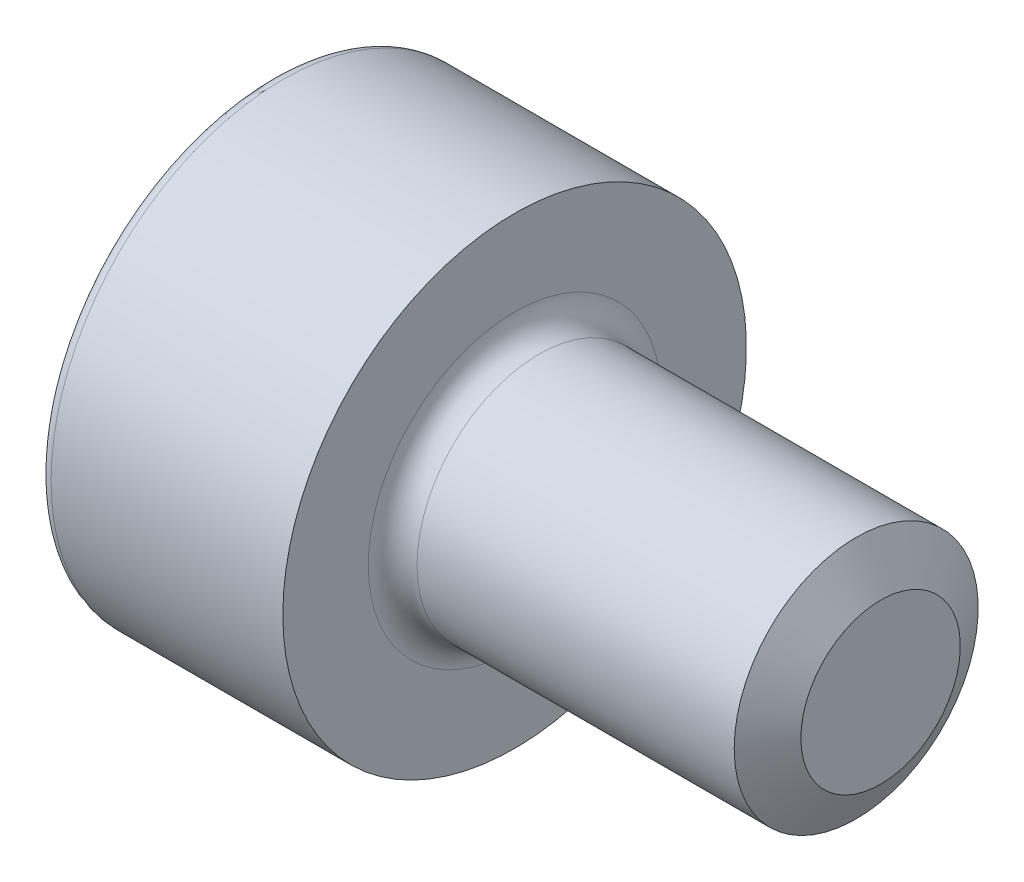
ISO-10303-21;
HEADER;
FILE_DESCRIPTION(('STEP AP214'),'2;1');
FILE_NAME('part.step','',(''),(''),'','','');
FILE_SCHEMA(('AUTOMOTIVE_DESIGN { 1 0 10303 214 1 1 1 1 }'));
ENDSEC;
DATA;
#1=APPLICATION_CONTEXT('core data for automotive mechanical design processes');
#2=APPLICATION_PROTOCOL_DEFINITION('international standard','automotive_design',2000,#1);
#3=PRODUCT_CONTEXT('',#1,'mechanical');
#4=PRODUCT('Part','Part','',(#3));
#5=PRODUCT_RELATED_PRODUCT_CATEGORY('part','',(#4));
#6=PRODUCT_DEFINITION_FORMATION('','',#4);
#7=PRODUCT_DEFINITION_CONTEXT('part definition',#1,'design');
#8=PRODUCT_DEFINITION('design','',#6,#7);
#9=PRODUCT_DEFINITION_SHAPE('','',#8);
#10=(LENGTH_UNIT() NAMED_UNIT(*) SI_UNIT(.MILLI.,.METRE.));
#11=(NAMED_UNIT(*) PLANE_ANGLE_UNIT() SI_UNIT($,.RADIAN.));
#12=(NAMED_UNIT(*) SI_UNIT($,.STERADIAN.) SOLID_ANGLE_UNIT());
#13=UNCERTAINTY_MEASURE_WITH_UNIT(LENGTH_MEASURE(1.E-05),#10,'distance_accuracy_value','');
#14=(GEOMETRIC_REPRESENTATION_CONTEXT(3) GLOBAL_UNCERTAINTY_ASSIGNED_CONTEXT((#13)) GLOBAL_UNIT_ASSIGNED_CONTEXT((#10,
#11,#12)) REPRESENTATION_CONTEXT('',''));
#15=CARTESIAN_POINT('',(0.,0.,0.));
#16=DIRECTION('',(0.,0.,1.));
#17=DIRECTION('',(1.,0.,0.));
#18=AXIS2_PLACEMENT_3D('',#15,#16,#17);
#19=CARTESIAN_POINT('',(0.,0.,0.));
#20=DIRECTION('',(-1.,0.,0.));
#21=DIRECTION('',(0.,0.,1.));
#22=AXIS2_PLACEMENT_3D('',#19,#20,#21);
#23=CYLINDRICAL_SURFACE('',#22,1.);
#24=CARTESIAN_POINT('',(2.2,0.,0.));
#25=DIRECTION('',(-1.,0.,0.));
#26=DIRECTION('',(0.,0.,1.));
#27=AXIS2_PLACEMENT_3D('',#24,#25,#26);
#28=CIRCLE('',#27,1.);
#29=CARTESIAN_POINT('',(2.2,0.,1.));
#30=VERTEX_POINT('',#29);
#31=EDGE_CURVE('E115',#30,#30,#28,.T.);
#32=ORIENTED_EDGE('',*,*,#31,.F.);
#33=EDGE_LOOP('',(#32));
#34=FACE_BOUND('',#33,.T.);
#35=CARTESIAN_POINT('',(4.80000586675271,0.,0.));
#36=DIRECTION('',(-1.,0.,0.));
#37=DIRECTION('',(0.,0.,1.));
#38=AXIS2_PLACEMENT_3D('',#35,#36,#37);
#39=CIRCLE('',#38,1.);
#40=CARTESIAN_POINT('',(4.80000586675271,0.,1.));
#41=VERTEX_POINT('',#40);
#42=EDGE_CURVE('E297',#41,#41,#39,.T.);
#43=ORIENTED_EDGE('',*,*,#42,.T.);
#44=EDGE_LOOP('',(#43));
#45=FACE_BOUND('',#44,.T.);
#46=ADVANCED_FACE('F39',(#34,#45),#23,.T.);
#47=CARTESIAN_POINT('',(0.,0.,0.));
#48=DIRECTION('',(1.,0.,0.));
#49=DIRECTION('',(0.,0.,-1.));
#50=AXIS2_PLACEMENT_3D('',#47,#48,#49);
#51=PLANE('',#50);
#52=CARTESIAN_POINT('',(0.,0.,0.));
#53=DIRECTION('',(1.,0.,0.));
#54=DIRECTION('',(0.,0.,-1.));
#55=AXIS2_PLACEMENT_3D('',#52,#53,#54);
#56=CIRCLE('',#55,1.8);
#57=CARTESIAN_POINT('',(0.,0.,-1.8));
#58=VERTEX_POINT('',#57);
#59=EDGE_CURVE('E47',#58,#58,#56,.F.);
#60=ORIENTED_EDGE('',*,*,#59,.T.);
#61=EDGE_LOOP('',(#60));
#62=FACE_BOUND('',#61,.T.);
#63=DIRECTION('',(0.,0.866025403784439,-0.5));
#64=VECTOR('',#63,1.);
#65=CARTESIAN_POINT('',(0.,0.,0.865));
#66=LINE('',#65,#64);
#67=CARTESIAN_POINT('',(0.,0.,0.865));
#68=VERTEX_POINT('',#67);
#69=CARTESIAN_POINT('',(0.,0.749111974273539,0.4325));
#70=VERTEX_POINT('',#69);
#71=EDGE_CURVE('E330',#68,#70,#66,.T.);
#72=ORIENTED_EDGE('',*,*,#71,.F.);
#73=DIRECTION('',(0.,0.866025403784439,0.5));
#74=VECTOR('',#73,1.);
#75=CARTESIAN_POINT('',(0.,-0.749111974273539,0.4325));
#76=LINE('',#75,#74);
#77=CARTESIAN_POINT('',(0.,-0.749111974273539,0.4325));
#78=VERTEX_POINT('',#77);
#79=EDGE_CURVE('E54',#78,#68,#76,.T.);
#80=ORIENTED_EDGE('',*,*,#79,.F.);
#81=DIRECTION('',(0.,0.,1.));
#82=VECTOR('',#81,1.);
#83=CARTESIAN_POINT('',(0.,-0.749111974273539,-0.4325));
#84=LINE('',#83,#82);
#85=CARTESIAN_POINT('',(0.,-0.749111974273539,-0.4325));
#86=VERTEX_POINT('',#85);
#87=EDGE_CURVE('E90',#86,#78,#84,.T.);
#88=ORIENTED_EDGE('',*,*,#87,.F.);
#89=DIRECTION('',(0.,-0.866025403784439,0.5));
#90=VECTOR('',#89,1.);
#91=CARTESIAN_POINT('',(0.,0.,-0.865));
#92=LINE('',#91,#90);
#93=CARTESIAN_POINT('',(0.,0.,-0.865));
#94=VERTEX_POINT('',#93);
#95=EDGE_CURVE('E98',#94,#86,#92,.T.);
#96=ORIENTED_EDGE('',*,*,#95,.F.);
#97=DIRECTION('',(0.,-0.866025403784439,-0.5));
#98=VECTOR('',#97,1.);
#99=CARTESIAN_POINT('',(0.,0.749111974273539,-0.4325));
#100=LINE('',#99,#98);
#101=CARTESIAN_POINT('',(0.,0.749111974273539,-0.4325));
#102=VERTEX_POINT('',#101);
#103=EDGE_CURVE('E104',#102,#94,#100,.T.);
#104=ORIENTED_EDGE('',*,*,#103,.F.);
#105=DIRECTION('',(0.,0.,-1.));
#106=VECTOR('',#105,1.);
#107=CARTESIAN_POINT('',(0.,0.749111974273539,0.4325));
#108=LINE('',#107,#106);
#109=EDGE_CURVE('E333',#70,#102,#108,.T.);
#110=ORIENTED_EDGE('',*,*,#109,.F.);
#111=EDGE_LOOP('',(#72,#80,#88,#96,#104,#110));
#112=FACE_BOUND('',#111,.T.);
#113=ADVANCED_FACE('F107',(#62,#112),#51,.F.);
#114=CARTESIAN_POINT('',(0.,0.,0.));
#115=DIRECTION('',(-1.,0.,0.));
#116=DIRECTION('',(0.,0.,1.));
#117=AXIS2_PLACEMENT_3D('',#114,#115,#116);
#118=CYLINDRICAL_SURFACE('',#117,1.9);
#119=CARTESIAN_POINT('',(0.1,0.,0.));
#120=DIRECTION('',(1.,0.,0.));
#121=DIRECTION('',(0.,0.,-1.));
#122=AXIS2_PLACEMENT_3D('',#119,#120,#121);
#123=CIRCLE('',#122,1.9);
#124=CARTESIAN_POINT('',(0.1,0.,-1.9));
#125=VERTEX_POINT('',#124);
#126=EDGE_CURVE('E11',#125,#125,#123,.T.);
#127=ORIENTED_EDGE('',*,*,#126,.T.);
#128=EDGE_LOOP('',(#127));
#129=FACE_BOUND('',#128,.T.);
#130=CARTESIAN_POINT('',(2.,0.,0.));
#131=DIRECTION('',(-1.,0.,0.));
#132=DIRECTION('',(0.,0.,1.));
#133=AXIS2_PLACEMENT_3D('',#130,#131,#132);
#134=CIRCLE('',#133,1.9);
#135=CARTESIAN_POINT('',(2.,0.,1.9));
#136=VERTEX_POINT('',#135);
#137=EDGE_CURVE('E129',#136,#136,#134,.T.);
#138=ORIENTED_EDGE('',*,*,#137,.T.);
#139=EDGE_LOOP('',(#138));
#140=FACE_BOUND('',#139,.T.);
#141=ADVANCED_FACE('F152',(#129,#140),#118,.T.);
#142=CARTESIAN_POINT('',(2.,1.9,0.));
#143=DIRECTION('',(-1.,0.,0.));
#144=DIRECTION('',(0.,0.,1.));
#145=AXIS2_PLACEMENT_3D('',#142,#143,#144);
#146=PLANE('',#145);
#147=ORIENTED_EDGE('',*,*,#137,.F.);
#148=EDGE_LOOP('',(#147));
#149=FACE_BOUND('',#148,.T.);
#150=CARTESIAN_POINT('',(2.,0.,0.));
#151=DIRECTION('',(-1.,0.,0.));
#152=DIRECTION('',(0.,0.,1.));
#153=AXIS2_PLACEMENT_3D('',#150,#151,#152);
#154=CIRCLE('',#153,1.2);
#155=CARTESIAN_POINT('',(2.,0.,1.2));
#156=VERTEX_POINT('',#155);
#157=EDGE_CURVE('E126',#156,#156,#154,.T.);
#158=ORIENTED_EDGE('',*,*,#157,.T.);
#159=EDGE_LOOP('',(#158));
#160=FACE_BOUND('',#159,.T.);
#161=ADVANCED_FACE('F161',(#149,#160),#146,.F.);
#162=CARTESIAN_POINT('',(2.2,0.,0.));
#163=DIRECTION('',(-1.,0.,0.));
#164=DIRECTION('',(0.,0.,1.));
#165=AXIS2_PLACEMENT_3D('',#162,#163,#164);
#166=TOROIDAL_SURFACE('',#165,1.2,0.2);
#167=ORIENTED_EDGE('',*,*,#157,.F.);
#168=EDGE_LOOP('',(#167));
#169=FACE_BOUND('',#168,.T.);
#170=ORIENTED_EDGE('',*,*,#31,.T.);
#171=EDGE_LOOP('',(#170));
#172=FACE_BOUND('',#171,.T.);
#173=ADVANCED_FACE('F157',(#169,#172),#166,.F.);
#174=CARTESIAN_POINT('',(1.,-0.749111974273539,0.4325));
#175=DIRECTION('',(0.,-0.5,0.866025403784439));
#176=DIRECTION('',(0.,-0.866025403784439,-0.5));
#177=AXIS2_PLACEMENT_3D('',#174,#175,#176);
#178=PLANE('',#177);
#179=ORIENTED_EDGE('',*,*,#79,.T.);
#180=DIRECTION('',(-1.,0.,0.));
#181=VECTOR('',#180,1.);
#182=CARTESIAN_POINT('',(1.,0.,0.865));
#183=LINE('',#182,#181);
#184=CARTESIAN_POINT('',(1.,0.,0.865));
#185=VERTEX_POINT('',#184);
#186=EDGE_CURVE('E122',#185,#68,#183,.T.);
#187=ORIENTED_EDGE('',*,*,#186,.F.);
#188=DIRECTION('',(0.,0.866025403784439,0.5));
#189=VECTOR('',#188,1.);
#190=CARTESIAN_POINT('',(1.,-0.749111974273539,0.4325));
#191=LINE('',#190,#189);
#192=CARTESIAN_POINT('',(1.,-0.749111974273539,0.4325));
#193=VERTEX_POINT('',#192);
#194=EDGE_CURVE('E108',#193,#185,#191,.T.);
#195=ORIENTED_EDGE('',*,*,#194,.F.);
#196=DIRECTION('',(-1.,0.,0.));
#197=VECTOR('',#196,1.);
#198=CARTESIAN_POINT('',(1.,-0.749111974273539,0.4325));
#199=LINE('',#198,#197);
#200=EDGE_CURVE('E94',#193,#78,#199,.T.);
#201=ORIENTED_EDGE('',*,*,#200,.T.);
#202=EDGE_LOOP('',(#179,#187,#195,#201));
#203=FACE_BOUND('',#202,.T.);
#204=ADVANCED_FACE('F160',(#203),#178,.F.);
#205=CARTESIAN_POINT('',(1.,-0.749111974273539,-0.4325));
#206=DIRECTION('',(0.,-1.,0.));
#207=DIRECTION('',(0.,0.,-1.));
#208=AXIS2_PLACEMENT_3D('',#205,#206,#207);
#209=PLANE('',#208);
#210=ORIENTED_EDGE('',*,*,#87,.T.);
#211=ORIENTED_EDGE('',*,*,#200,.F.);
#212=DIRECTION('',(0.,0.,1.));
#213=VECTOR('',#212,1.);
#214=CARTESIAN_POINT('',(1.,-0.749111974273539,-0.4325));
#215=LINE('',#214,#213);
#216=CARTESIAN_POINT('',(1.,-0.749111974273539,-0.4325));
#217=VERTEX_POINT('',#216);
#218=EDGE_CURVE('E91',#217,#193,#215,.T.);
#219=ORIENTED_EDGE('',*,*,#218,.F.);
#220=DIRECTION('',(-1.,0.,0.));
#221=VECTOR('',#220,1.);
#222=CARTESIAN_POINT('',(1.,-0.749111974273539,-0.4325));
#223=LINE('',#222,#221);
#224=EDGE_CURVE('E85',#217,#86,#223,.T.);
#225=ORIENTED_EDGE('',*,*,#224,.T.);
#226=EDGE_LOOP('',(#210,#211,#219,#225));
#227=FACE_BOUND('',#226,.T.);
#228=ADVANCED_FACE('F87',(#227),#209,.F.);
#229=CARTESIAN_POINT('',(1.,0.,-0.865));
#230=DIRECTION('',(0.,-0.5,-0.866025403784439));
#231=DIRECTION('',(0.,0.866025403784439,-0.5));
#232=AXIS2_PLACEMENT_3D('',#229,#230,#231);
#233=PLANE('',#232);
#234=ORIENTED_EDGE('',*,*,#95,.T.);
#235=ORIENTED_EDGE('',*,*,#224,.F.);
#236=DIRECTION('',(0.,-0.866025403784439,0.5));
#237=VECTOR('',#236,1.);
#238=CARTESIAN_POINT('',(1.,0.,-0.865));
#239=LINE('',#238,#237);
#240=CARTESIAN_POINT('',(1.,0.,-0.865));
#241=VERTEX_POINT('',#240);
#242=EDGE_CURVE('E326',#241,#217,#239,.T.);
#243=ORIENTED_EDGE('',*,*,#242,.F.);
#244=DIRECTION('',(-1.,0.,0.));
#245=VECTOR('',#244,1.);
#246=CARTESIAN_POINT('',(1.,0.,-0.865));
#247=LINE('',#246,#245);
#248=EDGE_CURVE('E95',#241,#94,#247,.T.);
#249=ORIENTED_EDGE('',*,*,#248,.T.);
#250=EDGE_LOOP('',(#234,#235,#243,#249));
#251=FACE_BOUND('',#250,.T.);
#252=ADVANCED_FACE('F99',(#251),#233,.F.);
#253=CARTESIAN_POINT('',(1.,0.749111974273539,-0.4325));
#254=DIRECTION('',(0.,0.5,-0.866025403784439));
#255=DIRECTION('',(0.,0.866025403784439,0.5));
#256=AXIS2_PLACEMENT_3D('',#253,#254,#255);
#257=PLANE('',#256);
#258=ORIENTED_EDGE('',*,*,#103,.T.);
#259=ORIENTED_EDGE('',*,*,#248,.F.);
#260=DIRECTION('',(0.,-0.866025403784439,-0.5));
#261=VECTOR('',#260,1.);
#262=CARTESIAN_POINT('',(1.,0.749111974273539,-0.4325));
#263=LINE('',#262,#261);
#264=CARTESIAN_POINT('',(1.,0.749111974273539,-0.4325));
#265=VERTEX_POINT('',#264);
#266=EDGE_CURVE('E323',#265,#241,#263,.T.);
#267=ORIENTED_EDGE('',*,*,#266,.F.);
#268=DIRECTION('',(-1.,0.,0.));
#269=VECTOR('',#268,1.);
#270=CARTESIAN_POINT('',(1.,0.749111974273539,-0.4325));
#271=LINE('',#270,#269);
#272=EDGE_CURVE('E118',#265,#102,#271,.T.);
#273=ORIENTED_EDGE('',*,*,#272,.T.);
#274=EDGE_LOOP('',(#258,#259,#267,#273));
#275=FACE_BOUND('',#274,.T.);
#276=ADVANCED_FACE('F202',(#275),#257,.F.);
#277=CARTESIAN_POINT('',(1.,0.749111974273539,0.4325));
#278=DIRECTION('',(0.,1.,0.));
#279=DIRECTION('',(0.,0.,1.));
#280=AXIS2_PLACEMENT_3D('',#277,#278,#279);
#281=PLANE('',#280);
#282=ORIENTED_EDGE('',*,*,#109,.T.);
#283=ORIENTED_EDGE('',*,*,#272,.F.);
#284=DIRECTION('',(0.,0.,-1.));
#285=VECTOR('',#284,1.);
#286=CARTESIAN_POINT('',(1.,0.749111974273539,0.4325));
#287=LINE('',#286,#285);
#288=CARTESIAN_POINT('',(1.,0.749111974273539,0.4325));
#289=VERTEX_POINT('',#288);
#290=EDGE_CURVE('E320',#289,#265,#287,.T.);
#291=ORIENTED_EDGE('',*,*,#290,.F.);
#292=DIRECTION('',(-1.,0.,0.));
#293=VECTOR('',#292,1.);
#294=CARTESIAN_POINT('',(1.,0.749111974273539,0.4325));
#295=LINE('',#294,#293);
#296=EDGE_CURVE('E120',#289,#70,#295,.T.);
#297=ORIENTED_EDGE('',*,*,#296,.T.);
#298=EDGE_LOOP('',(#282,#283,#291,#297));
#299=FACE_BOUND('',#298,.T.);
#300=ADVANCED_FACE('F209',(#299),#281,.F.);
#301=CARTESIAN_POINT('',(1.,0.,0.865));
#302=DIRECTION('',(0.,0.5,0.866025403784439));
#303=DIRECTION('',(0.,-0.866025403784439,0.5));
#304=AXIS2_PLACEMENT_3D('',#301,#302,#303);
#305=PLANE('',#304);
#306=ORIENTED_EDGE('',*,*,#71,.T.);
#307=ORIENTED_EDGE('',*,*,#296,.F.);
#308=DIRECTION('',(0.,0.866025403784439,-0.5));
#309=VECTOR('',#308,1.);
#310=CARTESIAN_POINT('',(1.,0.,0.865));
#311=LINE('',#310,#309);
#312=EDGE_CURVE('E111',#185,#289,#311,.T.);
#313=ORIENTED_EDGE('',*,*,#312,.F.);
#314=ORIENTED_EDGE('',*,*,#186,.T.);
#315=EDGE_LOOP('',(#306,#307,#313,#314));
#316=FACE_BOUND('',#315,.T.);
#317=ADVANCED_FACE('F217',(#316),#305,.F.);
#318=CARTESIAN_POINT('',(1.,-0.749111974273539,-0.4325));
#319=DIRECTION('',(-0.996035719954435,0.0444770856027303,0.0770365720365191));
#320=DIRECTION('',(0.0771128825766104,0.,0.997022368525765));
#321=AXIS2_PLACEMENT_3D('',#318,#319,#320);
#322=PLANE('',#321);
#323=DIRECTION('',(-0.0771128825766104,-0.863446699284643,-0.498511184262883));
#324=VECTOR('',#323,1.);
#325=CARTESIAN_POINT('',(1.06690185249043,0.,0.));
#326=LINE('',#325,#324);
#327=CARTESIAN_POINT('',(1.06690185249043,0.,0.));
#328=VERTEX_POINT('',#327);
#329=EDGE_CURVE('E63',#328,#217,#326,.T.);
#330=ORIENTED_EDGE('',*,*,#329,.F.);
#331=DIRECTION('',(-0.0771128825766104,0.,-0.997022368525765));
#332=VECTOR('',#331,1.);
#333=CARTESIAN_POINT('',(1.06690185249043,0.,0.));
#334=LINE('',#333,#332);
#335=EDGE_CURVE('E306',#328,#241,#334,.T.);
#336=ORIENTED_EDGE('',*,*,#335,.T.);
#337=ORIENTED_EDGE('',*,*,#242,.T.);
#338=EDGE_LOOP('',(#330,#336,#337));
#339=FACE_BOUND('',#338,.T.);
#340=ADVANCED_FACE('F225',(#339),#322,.T.);
#341=CARTESIAN_POINT('',(1.,0.,-0.865));
#342=DIRECTION('',(-0.996035719954435,-0.0444770856027303,0.0770365720365191));
#343=DIRECTION('',(0.0771128825766104,0.,0.997022368525765));
#344=AXIS2_PLACEMENT_3D('',#341,#342,#343);
#345=PLANE('',#344);
#346=ORIENTED_EDGE('',*,*,#335,.F.);
#347=DIRECTION('',(-0.0771128825766104,0.863446699284643,-0.498511184262882));
#348=VECTOR('',#347,1.);
#349=CARTESIAN_POINT('',(1.06690185249043,0.,0.));
#350=LINE('',#349,#348);
#351=EDGE_CURVE('E310',#328,#265,#350,.T.);
#352=ORIENTED_EDGE('',*,*,#351,.T.);
#353=ORIENTED_EDGE('',*,*,#266,.T.);
#354=EDGE_LOOP('',(#346,#352,#353));
#355=FACE_BOUND('',#354,.T.);
#356=ADVANCED_FACE('F233',(#355),#345,.T.);
#357=CARTESIAN_POINT('',(1.,-0.749111974273539,0.4325));
#358=DIRECTION('',(-0.996035719954435,0.0889541712054606,0.));
#359=DIRECTION('',(-0.0889541712054606,-0.996035719954435,0.));
#360=AXIS2_PLACEMENT_3D('',#357,#358,#359);
#361=PLANE('',#360);
#362=DIRECTION('',(-0.0771128825766104,-0.863446699284643,0.498511184262883));
#363=VECTOR('',#362,1.);
#364=CARTESIAN_POINT('',(1.06690185249043,0.,0.));
#365=LINE('',#364,#363);
#366=EDGE_CURVE('E313',#328,#193,#365,.T.);
#367=ORIENTED_EDGE('',*,*,#366,.F.);
#368=ORIENTED_EDGE('',*,*,#329,.T.);
#369=ORIENTED_EDGE('',*,*,#218,.T.);
#370=EDGE_LOOP('',(#367,#368,#369));
#371=FACE_BOUND('',#370,.T.);
#372=ADVANCED_FACE('F241',(#371),#361,.T.);
#373=CARTESIAN_POINT('',(1.,0.749111974273539,-0.4325));
#374=DIRECTION('',(-0.996035719954435,-0.0889541712054606,0.));
#375=DIRECTION('',(0.0889541712054606,-0.996035719954435,0.));
#376=AXIS2_PLACEMENT_3D('',#373,#374,#375);
#377=PLANE('',#376);
#378=ORIENTED_EDGE('',*,*,#351,.F.);
#379=DIRECTION('',(-0.0771128825766104,0.863446699284643,0.498511184262883));
#380=VECTOR('',#379,1.);
#381=CARTESIAN_POINT('',(1.06690185249043,0.,0.));
#382=LINE('',#381,#380);
#383=EDGE_CURVE('E301',#328,#289,#382,.T.);
#384=ORIENTED_EDGE('',*,*,#383,.T.);
#385=ORIENTED_EDGE('',*,*,#290,.T.);
#386=EDGE_LOOP('',(#378,#384,#385));
#387=FACE_BOUND('',#386,.T.);
#388=ADVANCED_FACE('F249',(#387),#377,.T.);
#389=CARTESIAN_POINT('',(1.,0.,0.865));
#390=DIRECTION('',(-0.996035719954435,0.0444770856027303,-0.0770365720365191));
#391=DIRECTION('',(-0.0771128825766104,0.,0.997022368525765));
#392=AXIS2_PLACEMENT_3D('',#389,#390,#391);
#393=PLANE('',#392);
#394=DIRECTION('',(-0.0771128825766104,0.,0.997022368525765));
#395=VECTOR('',#394,1.);
#396=CARTESIAN_POINT('',(1.06690185249043,0.,0.));
#397=LINE('',#396,#395);
#398=EDGE_CURVE('E296',#328,#185,#397,.T.);
#399=ORIENTED_EDGE('',*,*,#398,.F.);
#400=ORIENTED_EDGE('',*,*,#366,.T.);
#401=ORIENTED_EDGE('',*,*,#194,.T.);
#402=EDGE_LOOP('',(#399,#400,#401));
#403=FACE_BOUND('',#402,.T.);
#404=ADVANCED_FACE('F256',(#403),#393,.T.);
#405=CARTESIAN_POINT('',(1.,0.749111974273539,0.4325));
#406=DIRECTION('',(-0.996035719954435,-0.0444770856027303,-0.077036572036519));
#407=DIRECTION('',(-0.0771128825766104,0.,0.997022368525765));
#408=AXIS2_PLACEMENT_3D('',#405,#406,#407);
#409=PLANE('',#408);
#410=ORIENTED_EDGE('',*,*,#383,.F.);
#411=ORIENTED_EDGE('',*,*,#398,.T.);
#412=ORIENTED_EDGE('',*,*,#312,.T.);
#413=EDGE_LOOP('',(#410,#411,#412));
#414=FACE_BOUND('',#413,.T.);
#415=ADVANCED_FACE('F264',(#414),#409,.T.);
#416=CARTESIAN_POINT('',(4.80000586675271,0.,0.));
#417=DIRECTION('',(-1.,0.,0.));
#418=DIRECTION('',(0.,0.,1.));
#419=AXIS2_PLACEMENT_3D('',#416,#417,#418);
#420=CONICAL_SURFACE('',#419,1.,1.04719755119659);
#421=CARTESIAN_POINT('',(5.,0.,0.));
#422=DIRECTION('',(-1.,0.,0.));
#423=DIRECTION('',(0.,0.,1.));
#424=AXIS2_PLACEMENT_3D('',#421,#422,#423);
#425=CIRCLE('',#424,0.6536);
#426=CARTESIAN_POINT('',(5.,0.,0.6536));
#427=VERTEX_POINT('',#426);
#428=EDGE_CURVE('E293',#427,#427,#425,.T.);
#429=ORIENTED_EDGE('',*,*,#428,.T.);
#430=EDGE_LOOP('',(#429));
#431=FACE_BOUND('',#430,.T.);
#432=ORIENTED_EDGE('',*,*,#42,.F.);
#433=EDGE_LOOP('',(#432));
#434=FACE_BOUND('',#433,.T.);
#435=ADVANCED_FACE('F142',(#431,#434),#420,.T.);
#436=CARTESIAN_POINT('',(5.,1.,0.));
#437=DIRECTION('',(-1.,0.,0.));
#438=DIRECTION('',(0.,0.,1.));
#439=AXIS2_PLACEMENT_3D('',#436,#437,#438);
#440=PLANE('',#439);
#441=ORIENTED_EDGE('',*,*,#428,.F.);
#442=EDGE_LOOP('',(#441));
#443=FACE_BOUND('',#442,.T.);
#444=ADVANCED_FACE('F137',(#443),#440,.F.);
#445=CARTESIAN_POINT('',(0.1,0.,0.));
#446=DIRECTION('',(1.,0.,0.));
#447=DIRECTION('',(0.,0.,-1.));
#448=AXIS2_PLACEMENT_3D('',#445,#446,#447);
#449=TOROIDAL_SURFACE('',#448,1.8,0.1);
#450=ORIENTED_EDGE('',*,*,#126,.F.);
#451=EDGE_LOOP('',(#450));
#452=FACE_BOUND('',#451,.T.);
#453=ORIENTED_EDGE('',*,*,#59,.F.);
#454=EDGE_LOOP('',(#453));
#455=FACE_BOUND('',#454,.T.);
#456=ADVANCED_FACE('F41',(#452,#455),#449,.T.);
#457=CLOSED_SHELL('',(#46,#113,#141,#161,#173,#204,#228,#252,#276,#300,#317,#340,#356,#372,#388,
#404,#415,#435,#444,#456));
#458=MANIFOLD_SOLID_BREP('B2',#457);
#459=ADVANCED_BREP_SHAPE_REPRESENTATION('',(#18,#458),#14);
#460=SHAPE_DEFINITION_REPRESENTATION(#9,#459);
ENDSEC;
END-ISO-10303-21;
